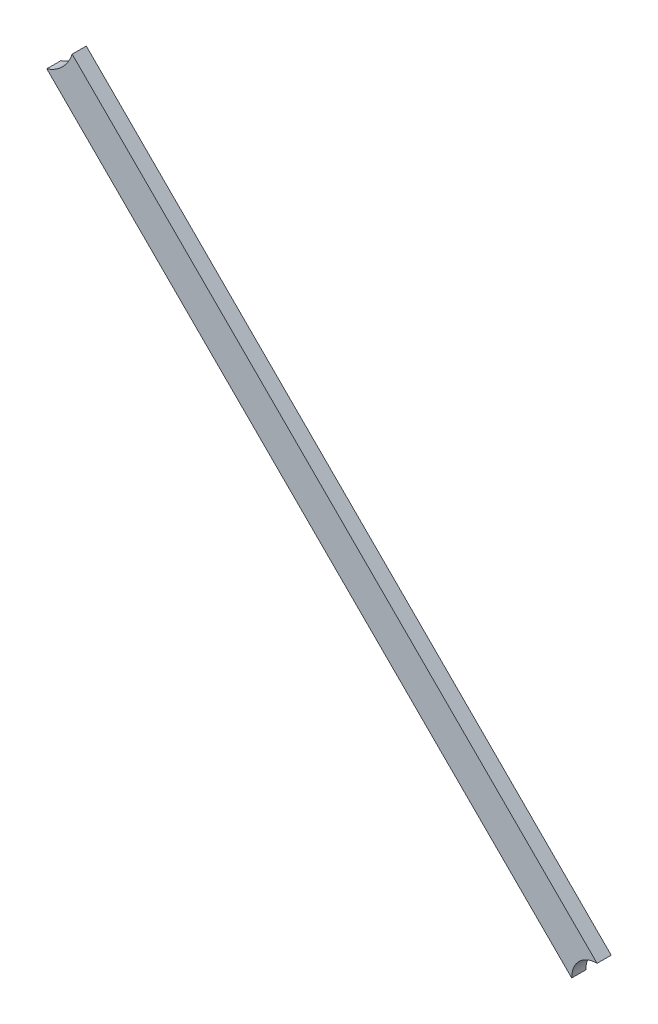
ISO-10303-21;
HEADER;
FILE_DESCRIPTION(('STEP AP214'),'2;1');
FILE_NAME('part.step','',(''),(''),'','','');
FILE_SCHEMA(('AUTOMOTIVE_DESIGN { 1 0 10303 214 1 1 1 1 }'));
ENDSEC;
DATA;
#1=APPLICATION_CONTEXT('core data for automotive mechanical design processes');
#2=APPLICATION_PROTOCOL_DEFINITION('international standard','automotive_design',2000,#1);
#3=PRODUCT_CONTEXT('',#1,'mechanical');
#4=PRODUCT('Part','Part','',(#3));
#5=PRODUCT_RELATED_PRODUCT_CATEGORY('part','',(#4));
#6=PRODUCT_DEFINITION_FORMATION('','',#4);
#7=PRODUCT_DEFINITION_CONTEXT('part definition',#1,'design');
#8=PRODUCT_DEFINITION('design','',#6,#7);
#9=PRODUCT_DEFINITION_SHAPE('','',#8);
#10=(LENGTH_UNIT() NAMED_UNIT(*) SI_UNIT(.MILLI.,.METRE.));
#11=(NAMED_UNIT(*) PLANE_ANGLE_UNIT() SI_UNIT($,.RADIAN.));
#12=(NAMED_UNIT(*) SI_UNIT($,.STERADIAN.) SOLID_ANGLE_UNIT());
#13=UNCERTAINTY_MEASURE_WITH_UNIT(LENGTH_MEASURE(1.E-05),#10,'distance_accuracy_value','');
#14=(GEOMETRIC_REPRESENTATION_CONTEXT(3) GLOBAL_UNCERTAINTY_ASSIGNED_CONTEXT((#13)) GLOBAL_UNIT_ASSIGNED_CONTEXT((#10,
#11,#12)) REPRESENTATION_CONTEXT('',''));
#15=CARTESIAN_POINT('',(0.,0.,0.));
#16=DIRECTION('',(0.,0.,1.));
#17=DIRECTION('',(1.,0.,0.));
#18=AXIS2_PLACEMENT_3D('',#15,#16,#17);
#19=CARTESIAN_POINT('',(113.954064664847,95.6104615951531,0.));
#20=DIRECTION('',(0.707106781186548,0.707106781186548,0.));
#21=DIRECTION('',(0.707106781186548,-0.707106781186548,0.));
#22=AXIS2_PLACEMENT_3D('',#19,#20,#21);
#23=PLANE('',#22);
#24=DIRECTION('',(0.707106781186548,-0.707106781186548,0.));
#25=VECTOR('',#24,1.);
#26=CARTESIAN_POINT('',(113.60512966,95.9593966,0.1999996));
#27=LINE('',#26,#25);
#28=CARTESIAN_POINT('',(113.954064664847,95.6104615951531,0.1999996));
#29=VERTEX_POINT('',#28);
#30=CARTESIAN_POINT('',(121.386618506202,88.1779077537985,0.1999996));
#31=VERTEX_POINT('',#30);
#32=EDGE_CURVE('E11',#29,#31,#27,.T.);
#33=ORIENTED_EDGE('',*,*,#32,.F.);
#34=DIRECTION('',(0.,0.,1.));
#35=VECTOR('',#34,1.);
#36=CARTESIAN_POINT('',(113.954064664847,95.6104615951531,0.));
#37=LINE('',#36,#35);
#38=CARTESIAN_POINT('',(113.954064664847,95.6104615951531,0.));
#39=VERTEX_POINT('',#38);
#40=EDGE_CURVE('E24',#39,#29,#37,.T.);
#41=ORIENTED_EDGE('',*,*,#40,.F.);
#42=DIRECTION('',(0.707106781186548,-0.707106781186548,0.));
#43=VECTOR('',#42,1.);
#44=CARTESIAN_POINT('',(113.60512966,95.9593966,0.));
#45=LINE('',#44,#43);
#46=CARTESIAN_POINT('',(121.386618506202,88.1779077537985,0.));
#47=VERTEX_POINT('',#46);
#48=EDGE_CURVE('E75',#39,#47,#45,.T.);
#49=ORIENTED_EDGE('',*,*,#48,.T.);
#50=DIRECTION('',(0.,0.,1.));
#51=VECTOR('',#50,1.);
#52=CARTESIAN_POINT('',(121.386618506202,88.1779077537985,0.));
#53=LINE('',#52,#51);
#54=EDGE_CURVE('E37',#47,#31,#53,.T.);
#55=ORIENTED_EDGE('',*,*,#54,.T.);
#56=EDGE_LOOP('',(#33,#41,#49,#55));
#57=FACE_BOUND('',#56,.T.);
#58=ADVANCED_FACE('F17',(#57),#23,.F.);
#59=CARTESIAN_POINT('',(121.7422,88.1815356,0.));
#60=DIRECTION('',(0.,0.,-1.));
#61=DIRECTION('',(1.,0.,0.));
#62=AXIS2_PLACEMENT_3D('',#59,#60,#61);
#63=CYLINDRICAL_SURFACE('',#62,0.3556);
#64=DIRECTION('',(0.,0.,1.));
#65=VECTOR('',#64,1.);
#66=CARTESIAN_POINT('',(121.745827846202,88.5371170937984,0.));
#67=LINE('',#66,#65);
#68=CARTESIAN_POINT('',(121.745827846202,88.5371170937984,0.));
#69=VERTEX_POINT('',#68);
#70=CARTESIAN_POINT('',(121.745827846202,88.5371170937984,0.1999996));
#71=VERTEX_POINT('',#70);
#72=EDGE_CURVE('E67',#69,#71,#67,.T.);
#73=ORIENTED_EDGE('',*,*,#72,.T.);
#74=CARTESIAN_POINT('',(121.7422,88.1815356,0.1999996));
#75=DIRECTION('',(0.,0.,1.));
#76=DIRECTION('',(1.,0.,0.));
#77=AXIS2_PLACEMENT_3D('',#74,#75,#76);
#78=CIRCLE('',#77,0.3556);
#79=EDGE_CURVE('E82',#71,#31,#78,.T.);
#80=ORIENTED_EDGE('',*,*,#79,.T.);
#81=ORIENTED_EDGE('',*,*,#54,.F.);
#82=CARTESIAN_POINT('',(121.7422,88.1815356,0.));
#83=DIRECTION('',(0.,0.,1.));
#84=DIRECTION('',(1.,0.,0.));
#85=AXIS2_PLACEMENT_3D('',#82,#83,#84);
#86=CIRCLE('',#85,0.3556);
#87=EDGE_CURVE('E80',#69,#47,#86,.T.);
#88=ORIENTED_EDGE('',*,*,#87,.F.);
#89=EDGE_LOOP('',(#73,#80,#81,#88));
#90=FACE_BOUND('',#89,.T.);
#91=ADVANCED_FACE('F88',(#90),#63,.F.);
#92=CARTESIAN_POINT('',(121.745827846202,88.5371170937984,0.));
#93=DIRECTION('',(-0.707106781186548,-0.707106781186547,0.));
#94=DIRECTION('',(-0.707106781186547,0.707106781186548,0.));
#95=AXIS2_PLACEMENT_3D('',#92,#93,#94);
#96=PLANE('',#95);
#97=DIRECTION('',(-0.707106781186547,0.707106781186548,0.));
#98=VECTOR('',#97,1.);
#99=CARTESIAN_POINT('',(121.92180594,88.361139,0.1999996));
#100=LINE('',#99,#98);
#101=CARTESIAN_POINT('',(114.313274004847,95.9696709351531,0.1999996));
#102=VERTEX_POINT('',#101);
#103=EDGE_CURVE('E71',#71,#102,#100,.T.);
#104=ORIENTED_EDGE('',*,*,#103,.F.);
#105=ORIENTED_EDGE('',*,*,#72,.F.);
#106=DIRECTION('',(-0.707106781186547,0.707106781186548,0.));
#107=VECTOR('',#106,1.);
#108=CARTESIAN_POINT('',(121.92180594,88.361139,0.));
#109=LINE('',#108,#107);
#110=CARTESIAN_POINT('',(114.313274004847,95.9696709351531,0.));
#111=VERTEX_POINT('',#110);
#112=EDGE_CURVE('E63',#69,#111,#109,.T.);
#113=ORIENTED_EDGE('',*,*,#112,.T.);
#114=DIRECTION('',(0.,0.,1.));
#115=VECTOR('',#114,1.);
#116=CARTESIAN_POINT('',(114.313274004847,95.9696709351531,0.));
#117=LINE('',#116,#115);
#118=EDGE_CURVE('E53',#111,#102,#117,.T.);
#119=ORIENTED_EDGE('',*,*,#118,.T.);
#120=EDGE_LOOP('',(#104,#105,#113,#119));
#121=FACE_BOUND('',#120,.T.);
#122=ADVANCED_FACE('F66',(#121),#96,.F.);
#123=CARTESIAN_POINT('',(113.7847356,96.139,0.));
#124=DIRECTION('',(0.,0.,-1.));
#125=DIRECTION('',(1.,0.,0.));
#126=AXIS2_PLACEMENT_3D('',#123,#124,#125);
#127=CYLINDRICAL_SURFACE('',#126,0.55500016);
#128=ORIENTED_EDGE('',*,*,#40,.T.);
#129=CARTESIAN_POINT('',(113.7847356,96.139,0.1999996));
#130=DIRECTION('',(0.,0.,1.));
#131=DIRECTION('',(1.,0.,0.));
#132=AXIS2_PLACEMENT_3D('',#129,#130,#131);
#133=CIRCLE('',#132,0.55500016);
#134=EDGE_CURVE('E59',#29,#102,#133,.T.);
#135=ORIENTED_EDGE('',*,*,#134,.T.);
#136=ORIENTED_EDGE('',*,*,#118,.F.);
#137=CARTESIAN_POINT('',(113.7847356,96.139,0.));
#138=DIRECTION('',(0.,0.,1.));
#139=DIRECTION('',(1.,0.,0.));
#140=AXIS2_PLACEMENT_3D('',#137,#138,#139);
#141=CIRCLE('',#140,0.55500016);
#142=EDGE_CURVE('E57',#39,#111,#141,.T.);
#143=ORIENTED_EDGE('',*,*,#142,.F.);
#144=EDGE_LOOP('',(#128,#135,#136,#143));
#145=FACE_BOUND('',#144,.T.);
#146=ADVANCED_FACE('F55',(#145),#127,.F.);
#147=CARTESIAN_POINT('',(113.60512966,95.9593966,0.));
#148=DIRECTION('',(0.,0.,-1.));
#149=DIRECTION('',(-1.,0.,0.));
#150=AXIS2_PLACEMENT_3D('',#147,#148,#149);
#151=PLANE('',#150);
#152=ORIENTED_EDGE('',*,*,#48,.F.);
#153=ORIENTED_EDGE('',*,*,#142,.T.);
#154=ORIENTED_EDGE('',*,*,#112,.F.);
#155=ORIENTED_EDGE('',*,*,#87,.T.);
#156=EDGE_LOOP('',(#152,#153,#154,#155));
#157=FACE_BOUND('',#156,.T.);
#158=ADVANCED_FACE('F74',(#157),#151,.T.);
#159=CARTESIAN_POINT('',(113.60512966,95.9593966,0.1999996));
#160=DIRECTION('',(0.,0.,-1.));
#161=DIRECTION('',(-1.,0.,0.));
#162=AXIS2_PLACEMENT_3D('',#159,#160,#161);
#163=PLANE('',#162);
#164=ORIENTED_EDGE('',*,*,#134,.F.);
#165=ORIENTED_EDGE('',*,*,#32,.T.);
#166=ORIENTED_EDGE('',*,*,#79,.F.);
#167=ORIENTED_EDGE('',*,*,#103,.T.);
#168=EDGE_LOOP('',(#164,#165,#166,#167));
#169=FACE_BOUND('',#168,.T.);
#170=ADVANCED_FACE('F91',(#169),#163,.F.);
#171=CLOSED_SHELL('',(#58,#91,#122,#146,#158,#170));
#172=MANIFOLD_SOLID_BREP('B1',#171);
#173=ADVANCED_BREP_SHAPE_REPRESENTATION('',(#18,#172),#14);
#174=SHAPE_DEFINITION_REPRESENTATION(#9,#173);
ENDSEC;
END-ISO-10303-21;
